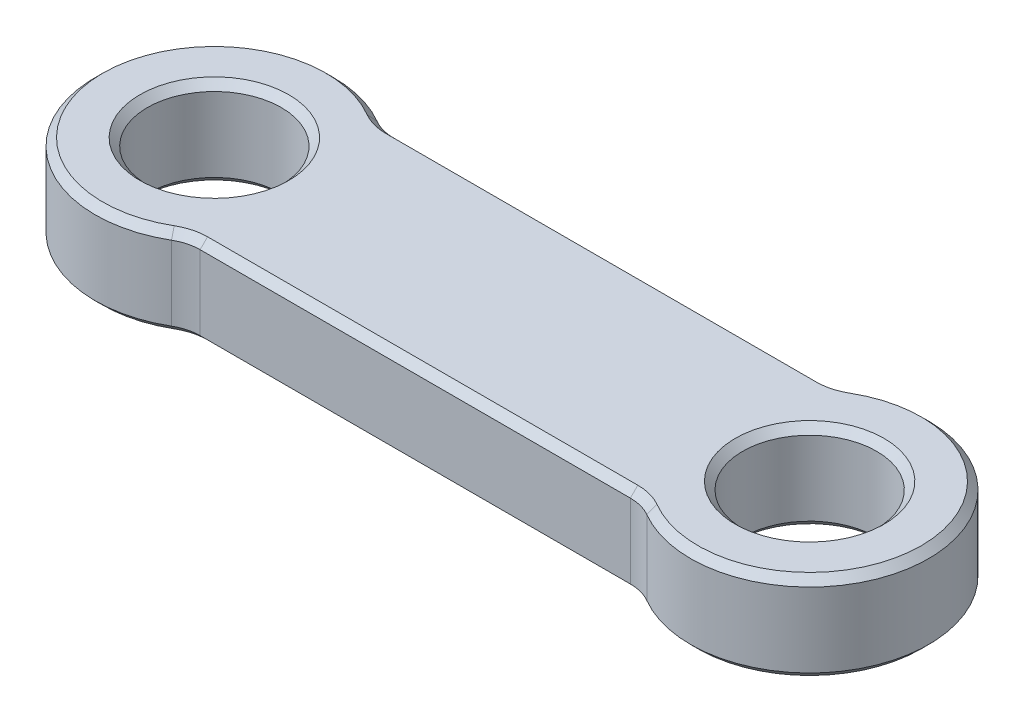
ISO-10303-21;
HEADER;
FILE_DESCRIPTION(('STEP AP214'),'2;1');
FILE_NAME('part.step','',(''),(''),'','','');
FILE_SCHEMA(('AUTOMOTIVE_DESIGN { 1 0 10303 214 1 1 1 1 }'));
ENDSEC;
DATA;
#1=APPLICATION_CONTEXT('core data for automotive mechanical design processes');
#2=APPLICATION_PROTOCOL_DEFINITION('international standard','automotive_design',2000,#1);
#3=PRODUCT_CONTEXT('',#1,'mechanical');
#4=PRODUCT('Part','Part','',(#3));
#5=PRODUCT_RELATED_PRODUCT_CATEGORY('part','',(#4));
#6=PRODUCT_DEFINITION_FORMATION('','',#4);
#7=PRODUCT_DEFINITION_CONTEXT('part definition',#1,'design');
#8=PRODUCT_DEFINITION('design','',#6,#7);
#9=PRODUCT_DEFINITION_SHAPE('','',#8);
#10=(LENGTH_UNIT() NAMED_UNIT(*) SI_UNIT(.MILLI.,.METRE.));
#11=(NAMED_UNIT(*) PLANE_ANGLE_UNIT() SI_UNIT($,.RADIAN.));
#12=(NAMED_UNIT(*) SI_UNIT($,.STERADIAN.) SOLID_ANGLE_UNIT());
#13=UNCERTAINTY_MEASURE_WITH_UNIT(LENGTH_MEASURE(1.E-05),#10,'distance_accuracy_value','');
#14=(GEOMETRIC_REPRESENTATION_CONTEXT(3) GLOBAL_UNCERTAINTY_ASSIGNED_CONTEXT((#13)) GLOBAL_UNIT_ASSIGNED_CONTEXT((#10,
#11,#12)) REPRESENTATION_CONTEXT('',''));
#15=CARTESIAN_POINT('',(0.,0.,0.));
#16=DIRECTION('',(0.,0.,1.));
#17=DIRECTION('',(1.,0.,0.));
#18=AXIS2_PLACEMENT_3D('',#15,#16,#17);
#19=CARTESIAN_POINT('',(-20.,6.,0.));
#20=DIRECTION('',(0.,-1.,0.));
#21=DIRECTION('',(0.,0.,-1.));
#22=AXIS2_PLACEMENT_3D('',#19,#20,#21);
#23=PLANE('',#22);
#24=CARTESIAN_POINT('',(20.,6.,0.));
#25=DIRECTION('',(0.,-1.,0.));
#26=DIRECTION('',(0.,0.,-1.));
#27=AXIS2_PLACEMENT_3D('',#24,#25,#26);
#28=CIRCLE('',#27,5.00000000000001);
#29=CARTESIAN_POINT('',(20.,6.,-5.00000000000001));
#30=VERTEX_POINT('',#29);
#31=EDGE_CURVE('E306',#30,#30,#28,.T.);
#32=ORIENTED_EDGE('',*,*,#31,.T.);
#33=EDGE_LOOP('',(#32));
#34=FACE_BOUND('',#33,.T.);
#35=CARTESIAN_POINT('',(-20.,6.,0.));
#36=DIRECTION('',(0.,-1.,0.));
#37=DIRECTION('',(0.,0.,-1.));
#38=AXIS2_PLACEMENT_3D('',#35,#36,#37);
#39=CIRCLE('',#38,5.00000000000001);
#40=CARTESIAN_POINT('',(-20.,6.,-5.00000000000001));
#41=VERTEX_POINT('',#40);
#42=EDGE_CURVE('E309',#41,#41,#39,.T.);
#43=ORIENTED_EDGE('',*,*,#42,.T.);
#44=EDGE_LOOP('',(#43));
#45=FACE_BOUND('',#44,.T.);
#46=CARTESIAN_POINT('',(-14.4547317467953,6.,9.5));
#47=DIRECTION('',(0.,-1.,0.));
#48=DIRECTION('',(0.,0.,-1.));
#49=AXIS2_PLACEMENT_3D('',#46,#47,#48);
#50=CIRCLE('',#49,3.49999999999999);
#51=CARTESIAN_POINT('',(-16.2191352819059,6.,6.47727272727273));
#52=VERTEX_POINT('',#51);
#53=CARTESIAN_POINT('',(-14.4547317467953,6.,6.));
#54=VERTEX_POINT('',#53);
#55=EDGE_CURVE('E317',#52,#54,#50,.T.);
#56=ORIENTED_EDGE('',*,*,#55,.T.);
#57=DIRECTION('',(1.,0.,0.));
#58=VECTOR('',#57,1.);
#59=CARTESIAN_POINT('',(-20.,6.,6.));
#60=LINE('',#59,#58);
#61=CARTESIAN_POINT('',(14.4547317467953,6.,6.));
#62=VERTEX_POINT('',#61);
#63=EDGE_CURVE('E312',#54,#62,#60,.T.);
#64=ORIENTED_EDGE('',*,*,#63,.T.);
#65=CARTESIAN_POINT('',(14.4547317467953,6.,9.5));
#66=DIRECTION('',(0.,-1.,0.));
#67=DIRECTION('',(0.,0.,-1.));
#68=AXIS2_PLACEMENT_3D('',#65,#66,#67);
#69=CIRCLE('',#68,3.49999999999999);
#70=CARTESIAN_POINT('',(16.2191352819059,6.,6.47727272727273));
#71=VERTEX_POINT('',#70);
#72=EDGE_CURVE('E315',#62,#71,#69,.T.);
#73=ORIENTED_EDGE('',*,*,#72,.T.);
#74=CARTESIAN_POINT('',(20.,6.,0.));
#75=DIRECTION('',(0.,-1.,0.));
#76=DIRECTION('',(0.,0.,-1.));
#77=AXIS2_PLACEMENT_3D('',#74,#75,#76);
#78=CIRCLE('',#77,7.5);
#79=CARTESIAN_POINT('',(16.2191352819059,6.,-6.47727272727273));
#80=VERTEX_POINT('',#79);
#81=EDGE_CURVE('E319',#71,#80,#78,.F.);
#82=ORIENTED_EDGE('',*,*,#81,.T.);
#83=CARTESIAN_POINT('',(14.4547317467953,6.,-9.5));
#84=DIRECTION('',(0.,-1.,0.));
#85=DIRECTION('',(0.,0.,-1.));
#86=AXIS2_PLACEMENT_3D('',#83,#84,#85);
#87=CIRCLE('',#86,3.49999999999999);
#88=CARTESIAN_POINT('',(14.4547317467953,6.,-6.00000000000001));
#89=VERTEX_POINT('',#88);
#90=EDGE_CURVE('E274',#80,#89,#87,.T.);
#91=ORIENTED_EDGE('',*,*,#90,.T.);
#92=DIRECTION('',(-1.,0.,0.));
#93=VECTOR('',#92,1.);
#94=CARTESIAN_POINT('',(-20.,6.,-6.00000000000001));
#95=LINE('',#94,#93);
#96=CARTESIAN_POINT('',(-14.4547317467953,6.,-6.00000000000001));
#97=VERTEX_POINT('',#96);
#98=EDGE_CURVE('E270',#89,#97,#95,.T.);
#99=ORIENTED_EDGE('',*,*,#98,.T.);
#100=CARTESIAN_POINT('',(-14.4547317467953,6.,-9.5));
#101=DIRECTION('',(0.,-1.,0.));
#102=DIRECTION('',(0.,0.,-1.));
#103=AXIS2_PLACEMENT_3D('',#100,#101,#102);
#104=CIRCLE('',#103,3.49999999999999);
#105=CARTESIAN_POINT('',(-16.2191352819059,6.,-6.47727272727273));
#106=VERTEX_POINT('',#105);
#107=EDGE_CURVE('E324',#97,#106,#104,.T.);
#108=ORIENTED_EDGE('',*,*,#107,.T.);
#109=CARTESIAN_POINT('',(-20.,6.,0.));
#110=DIRECTION('',(0.,-1.,0.));
#111=DIRECTION('',(0.,0.,-1.));
#112=AXIS2_PLACEMENT_3D('',#109,#110,#111);
#113=CIRCLE('',#112,7.50000000000001);
#114=EDGE_CURVE('E321',#106,#52,#113,.F.);
#115=ORIENTED_EDGE('',*,*,#114,.T.);
#116=EDGE_LOOP('',(#56,#64,#73,#82,#91,#99,#108,#115));
#117=FACE_BOUND('',#116,.T.);
#118=ADVANCED_FACE('F44',(#34,#45,#117),#23,.F.);
#119=CARTESIAN_POINT('',(-20.,0.,0.));
#120=DIRECTION('',(0.,-1.,0.));
#121=DIRECTION('',(0.,0.,-1.));
#122=AXIS2_PLACEMENT_3D('',#119,#120,#121);
#123=PLANE('',#122);
#124=CARTESIAN_POINT('',(20.,0.,0.));
#125=DIRECTION('',(0.,-1.,0.));
#126=DIRECTION('',(0.,0.,-1.));
#127=AXIS2_PLACEMENT_3D('',#124,#125,#126);
#128=CIRCLE('',#127,5.);
#129=CARTESIAN_POINT('',(20.,0.,-5.));
#130=VERTEX_POINT('',#129);
#131=EDGE_CURVE('E333',#130,#130,#128,.F.);
#132=ORIENTED_EDGE('',*,*,#131,.T.);
#133=EDGE_LOOP('',(#132));
#134=FACE_BOUND('',#133,.T.);
#135=CARTESIAN_POINT('',(-20.,0.,0.));
#136=DIRECTION('',(0.,-1.,0.));
#137=DIRECTION('',(0.,0.,-1.));
#138=AXIS2_PLACEMENT_3D('',#135,#136,#137);
#139=CIRCLE('',#138,5.);
#140=CARTESIAN_POINT('',(-20.,0.,-5.));
#141=VERTEX_POINT('',#140);
#142=EDGE_CURVE('E336',#141,#141,#139,.F.);
#143=ORIENTED_EDGE('',*,*,#142,.T.);
#144=EDGE_LOOP('',(#143));
#145=FACE_BOUND('',#144,.T.);
#146=CARTESIAN_POINT('',(14.4547317467953,0.,9.5));
#147=DIRECTION('',(0.,-1.,0.));
#148=DIRECTION('',(0.,0.,-1.));
#149=AXIS2_PLACEMENT_3D('',#146,#147,#148);
#150=CIRCLE('',#149,3.5);
#151=CARTESIAN_POINT('',(16.2191352819059,0.,6.47727272727272));
#152=VERTEX_POINT('',#151);
#153=CARTESIAN_POINT('',(14.4547317467953,0.,6.));
#154=VERTEX_POINT('',#153);
#155=EDGE_CURVE('E342',#152,#154,#150,.F.);
#156=ORIENTED_EDGE('',*,*,#155,.T.);
#157=DIRECTION('',(-1.,0.,0.));
#158=VECTOR('',#157,1.);
#159=CARTESIAN_POINT('',(-14.4547317467953,0.,5.99999999999999));
#160=LINE('',#159,#158);
#161=CARTESIAN_POINT('',(-14.4547317467953,0.,6.));
#162=VERTEX_POINT('',#161);
#163=EDGE_CURVE('E339',#154,#162,#160,.T.);
#164=ORIENTED_EDGE('',*,*,#163,.T.);
#165=CARTESIAN_POINT('',(-14.4547317467953,0.,9.5));
#166=DIRECTION('',(0.,-1.,0.));
#167=DIRECTION('',(0.,0.,-1.));
#168=AXIS2_PLACEMENT_3D('',#165,#166,#167);
#169=CIRCLE('',#168,3.5);
#170=CARTESIAN_POINT('',(-16.2191352819059,0.,6.47727272727273));
#171=VERTEX_POINT('',#170);
#172=EDGE_CURVE('E344',#162,#171,#169,.F.);
#173=ORIENTED_EDGE('',*,*,#172,.T.);
#174=CARTESIAN_POINT('',(-20.,0.,0.));
#175=DIRECTION('',(0.,-1.,0.));
#176=DIRECTION('',(0.,0.,-1.));
#177=AXIS2_PLACEMENT_3D('',#174,#175,#176);
#178=CIRCLE('',#177,7.5);
#179=CARTESIAN_POINT('',(-16.2191352819059,0.,-6.47727272727273));
#180=VERTEX_POINT('',#179);
#181=EDGE_CURVE('E165',#171,#180,#178,.T.);
#182=ORIENTED_EDGE('',*,*,#181,.T.);
#183=CARTESIAN_POINT('',(-14.4547317467953,0.,-9.5));
#184=DIRECTION('',(0.,-1.,0.));
#185=DIRECTION('',(0.,0.,-1.));
#186=AXIS2_PLACEMENT_3D('',#183,#184,#185);
#187=CIRCLE('',#186,3.5);
#188=CARTESIAN_POINT('',(-14.4547317467953,0.,-6.));
#189=VERTEX_POINT('',#188);
#190=EDGE_CURVE('E159',#180,#189,#187,.F.);
#191=ORIENTED_EDGE('',*,*,#190,.T.);
#192=DIRECTION('',(1.,0.,0.));
#193=VECTOR('',#192,1.);
#194=CARTESIAN_POINT('',(14.4547317467953,0.,-6.));
#195=LINE('',#194,#193);
#196=CARTESIAN_POINT('',(14.4547317467953,0.,-6.));
#197=VERTEX_POINT('',#196);
#198=EDGE_CURVE('E162',#189,#197,#195,.T.);
#199=ORIENTED_EDGE('',*,*,#198,.T.);
#200=CARTESIAN_POINT('',(14.4547317467953,0.,-9.5));
#201=DIRECTION('',(0.,-1.,0.));
#202=DIRECTION('',(0.,0.,-1.));
#203=AXIS2_PLACEMENT_3D('',#200,#201,#202);
#204=CIRCLE('',#203,3.5);
#205=CARTESIAN_POINT('',(16.2191352819059,0.,-6.47727272727272));
#206=VERTEX_POINT('',#205);
#207=EDGE_CURVE('E170',#197,#206,#204,.F.);
#208=ORIENTED_EDGE('',*,*,#207,.T.);
#209=CARTESIAN_POINT('',(20.,0.,0.));
#210=DIRECTION('',(0.,-1.,0.));
#211=DIRECTION('',(0.,0.,-1.));
#212=AXIS2_PLACEMENT_3D('',#209,#210,#211);
#213=CIRCLE('',#212,7.49999999999999);
#214=EDGE_CURVE('E346',#206,#152,#213,.T.);
#215=ORIENTED_EDGE('',*,*,#214,.T.);
#216=EDGE_LOOP('',(#156,#164,#173,#182,#191,#199,#208,#215));
#217=FACE_BOUND('',#216,.T.);
#218=ADVANCED_FACE('F161',(#134,#145,#217),#123,.T.);
#219=CARTESIAN_POINT('',(-20.,6.,0.));
#220=DIRECTION('',(0.,-1.,0.));
#221=DIRECTION('',(0.,0.,-1.));
#222=AXIS2_PLACEMENT_3D('',#219,#220,#221);
#223=CYLINDRICAL_SURFACE('',#222,8.00000000000001);
#224=DIRECTION('',(0.,-1.,0.));
#225=VECTOR('',#224,1.);
#226=CARTESIAN_POINT('',(-15.9670776340329,6.,-6.90909090909091));
#227=LINE('',#226,#225);
#228=CARTESIAN_POINT('',(-15.9670776340329,5.5,-6.90909090909091));
#229=VERTEX_POINT('',#228);
#230=CARTESIAN_POINT('',(-15.9670776340329,0.499999999999994,-6.90909090909091));
#231=VERTEX_POINT('',#230);
#232=EDGE_CURVE('E187',#229,#231,#227,.T.);
#233=ORIENTED_EDGE('',*,*,#232,.T.);
#234=CARTESIAN_POINT('',(-20.,0.499999999999994,0.));
#235=DIRECTION('',(0.,-1.,0.));
#236=DIRECTION('',(0.,0.,-1.));
#237=AXIS2_PLACEMENT_3D('',#234,#235,#236);
#238=CIRCLE('',#237,8.00000000000001);
#239=CARTESIAN_POINT('',(-15.9670776340329,0.499999999999994,6.90909090909091));
#240=VERTEX_POINT('',#239);
#241=EDGE_CURVE('E241',#231,#240,#238,.F.);
#242=ORIENTED_EDGE('',*,*,#241,.T.);
#243=DIRECTION('',(0.,-1.,0.));
#244=VECTOR('',#243,1.);
#245=CARTESIAN_POINT('',(-15.9670776340329,6.,6.90909090909091));
#246=LINE('',#245,#244);
#247=CARTESIAN_POINT('',(-15.9670776340329,5.5,6.90909090909091));
#248=VERTEX_POINT('',#247);
#249=EDGE_CURVE('E184',#240,#248,#246,.F.);
#250=ORIENTED_EDGE('',*,*,#249,.T.);
#251=CARTESIAN_POINT('',(-20.,5.5,0.));
#252=DIRECTION('',(0.,-1.,0.));
#253=DIRECTION('',(0.,0.,-1.));
#254=AXIS2_PLACEMENT_3D('',#251,#252,#253);
#255=CIRCLE('',#254,8.00000000000001);
#256=EDGE_CURVE('E247',#248,#229,#255,.T.);
#257=ORIENTED_EDGE('',*,*,#256,.T.);
#258=EDGE_LOOP('',(#233,#242,#250,#257));
#259=FACE_BOUND('',#258,.T.);
#260=ADVANCED_FACE('F360',(#259),#223,.T.);
#261=CARTESIAN_POINT('',(15.3363104734556,6.,6.5));
#262=DIRECTION('',(0.,0.,-1.));
#263=DIRECTION('',(-1.,0.,0.));
#264=AXIS2_PLACEMENT_3D('',#261,#262,#263);
#265=PLANE('',#264);
#266=DIRECTION('',(0.,1.,0.));
#267=VECTOR('',#266,1.);
#268=CARTESIAN_POINT('',(-14.4547317467953,0.,6.5));
#269=LINE('',#268,#267);
#270=CARTESIAN_POINT('',(-14.4547317467953,5.5,6.5));
#271=VERTEX_POINT('',#270);
#272=CARTESIAN_POINT('',(-14.4547317467953,0.499999999999994,6.5));
#273=VERTEX_POINT('',#272);
#274=EDGE_CURVE('E352',#271,#273,#269,.F.);
#275=ORIENTED_EDGE('',*,*,#274,.T.);
#276=DIRECTION('',(1.,0.,0.));
#277=VECTOR('',#276,1.);
#278=CARTESIAN_POINT('',(14.4547317467953,0.499999999999994,6.5));
#279=LINE('',#278,#277);
#280=CARTESIAN_POINT('',(14.4547317467953,0.499999999999994,6.5));
#281=VERTEX_POINT('',#280);
#282=EDGE_CURVE('E294',#273,#281,#279,.T.);
#283=ORIENTED_EDGE('',*,*,#282,.T.);
#284=DIRECTION('',(0.,1.,0.));
#285=VECTOR('',#284,1.);
#286=CARTESIAN_POINT('',(14.4547317467953,6.,6.5));
#287=LINE('',#286,#285);
#288=CARTESIAN_POINT('',(14.4547317467953,5.5,6.5));
#289=VERTEX_POINT('',#288);
#290=EDGE_CURVE('E180',#281,#289,#287,.T.);
#291=ORIENTED_EDGE('',*,*,#290,.T.);
#292=DIRECTION('',(-1.,0.,0.));
#293=VECTOR('',#292,1.);
#294=CARTESIAN_POINT('',(15.3363104734556,5.5,6.5));
#295=LINE('',#294,#293);
#296=EDGE_CURVE('E297',#289,#271,#295,.T.);
#297=ORIENTED_EDGE('',*,*,#296,.T.);
#298=EDGE_LOOP('',(#275,#283,#291,#297));
#299=FACE_BOUND('',#298,.T.);
#300=ADVANCED_FACE('F381',(#299),#265,.F.);
#301=CARTESIAN_POINT('',(20.,6.,0.));
#302=DIRECTION('',(0.,-1.,0.));
#303=DIRECTION('',(0.,0.,-1.));
#304=AXIS2_PLACEMENT_3D('',#301,#302,#303);
#305=CYLINDRICAL_SURFACE('',#304,7.99999999999999);
#306=DIRECTION('',(0.,-1.,0.));
#307=VECTOR('',#306,1.);
#308=CARTESIAN_POINT('',(15.9670776340329,6.,6.9090909090909));
#309=LINE('',#308,#307);
#310=CARTESIAN_POINT('',(15.9670776340329,5.5,6.9090909090909));
#311=VERTEX_POINT('',#310);
#312=CARTESIAN_POINT('',(15.9670776340329,0.499999999999994,6.9090909090909));
#313=VERTEX_POINT('',#312);
#314=EDGE_CURVE('E357',#311,#313,#309,.T.);
#315=ORIENTED_EDGE('',*,*,#314,.T.);
#316=CARTESIAN_POINT('',(20.,0.499999999999994,0.));
#317=DIRECTION('',(0.,-1.,0.));
#318=DIRECTION('',(0.,0.,-1.));
#319=AXIS2_PLACEMENT_3D('',#316,#317,#318);
#320=CIRCLE('',#319,7.99999999999999);
#321=CARTESIAN_POINT('',(15.9670776340329,0.499999999999994,-6.90909090909091));
#322=VERTEX_POINT('',#321);
#323=EDGE_CURVE('E251',#313,#322,#320,.F.);
#324=ORIENTED_EDGE('',*,*,#323,.T.);
#325=DIRECTION('',(0.,-1.,0.));
#326=VECTOR('',#325,1.);
#327=CARTESIAN_POINT('',(15.9670776340329,6.,-6.90909090909091));
#328=LINE('',#327,#326);
#329=CARTESIAN_POINT('',(15.9670776340329,5.5,-6.90909090909091));
#330=VERTEX_POINT('',#329);
#331=EDGE_CURVE('E355',#322,#330,#328,.F.);
#332=ORIENTED_EDGE('',*,*,#331,.T.);
#333=CARTESIAN_POINT('',(20.,5.5,0.));
#334=DIRECTION('',(0.,-1.,0.));
#335=DIRECTION('',(0.,0.,-1.));
#336=AXIS2_PLACEMENT_3D('',#333,#334,#335);
#337=CIRCLE('',#336,7.99999999999999);
#338=EDGE_CURVE('E278',#330,#311,#337,.T.);
#339=ORIENTED_EDGE('',*,*,#338,.T.);
#340=EDGE_LOOP('',(#315,#324,#332,#339));
#341=FACE_BOUND('',#340,.T.);
#342=ADVANCED_FACE('F422',(#341),#305,.T.);
#343=CARTESIAN_POINT('',(-15.3363104734556,6.,-6.5));
#344=DIRECTION('',(0.,0.,1.));
#345=DIRECTION('',(1.,0.,0.));
#346=AXIS2_PLACEMENT_3D('',#343,#344,#345);
#347=PLANE('',#346);
#348=DIRECTION('',(0.,1.,0.));
#349=VECTOR('',#348,1.);
#350=CARTESIAN_POINT('',(14.4547317467953,0.,-6.5));
#351=LINE('',#350,#349);
#352=CARTESIAN_POINT('',(14.4547317467953,5.5,-6.5));
#353=VERTEX_POINT('',#352);
#354=CARTESIAN_POINT('',(14.4547317467953,0.499999999999994,-6.5));
#355=VERTEX_POINT('',#354);
#356=EDGE_CURVE('E260',#353,#355,#351,.F.);
#357=ORIENTED_EDGE('',*,*,#356,.T.);
#358=DIRECTION('',(-1.,0.,0.));
#359=VECTOR('',#358,1.);
#360=CARTESIAN_POINT('',(-14.4547317467953,0.499999999999994,-6.5));
#361=LINE('',#360,#359);
#362=CARTESIAN_POINT('',(-14.4547317467953,0.499999999999994,-6.5));
#363=VERTEX_POINT('',#362);
#364=EDGE_CURVE('E11',#355,#363,#361,.T.);
#365=ORIENTED_EDGE('',*,*,#364,.T.);
#366=DIRECTION('',(0.,1.,0.));
#367=VECTOR('',#366,1.);
#368=CARTESIAN_POINT('',(-14.4547317467953,6.,-6.5));
#369=LINE('',#368,#367);
#370=CARTESIAN_POINT('',(-14.4547317467953,5.5,-6.5));
#371=VERTEX_POINT('',#370);
#372=EDGE_CURVE('E261',#363,#371,#369,.T.);
#373=ORIENTED_EDGE('',*,*,#372,.T.);
#374=DIRECTION('',(1.,0.,0.));
#375=VECTOR('',#374,1.);
#376=CARTESIAN_POINT('',(-15.3363104734556,5.5,-6.5));
#377=LINE('',#376,#375);
#378=EDGE_CURVE('E54',#371,#353,#377,.T.);
#379=ORIENTED_EDGE('',*,*,#378,.T.);
#380=EDGE_LOOP('',(#357,#365,#373,#379));
#381=FACE_BOUND('',#380,.T.);
#382=ADVANCED_FACE('F259',(#381),#347,.F.);
#383=CARTESIAN_POINT('',(-20.,6.,0.));
#384=DIRECTION('',(0.,-1.,0.));
#385=DIRECTION('',(0.,0.,-1.));
#386=AXIS2_PLACEMENT_3D('',#383,#384,#385);
#387=CYLINDRICAL_SURFACE('',#386,4.5);
#388=CARTESIAN_POINT('',(-20.,0.499999999999994,0.));
#389=DIRECTION('',(0.,-1.,0.));
#390=DIRECTION('',(0.,0.,-1.));
#391=AXIS2_PLACEMENT_3D('',#388,#389,#390);
#392=CIRCLE('',#391,4.5);
#393=CARTESIAN_POINT('',(-20.,0.499999999999994,-4.5));
#394=VERTEX_POINT('',#393);
#395=EDGE_CURVE('E300',#394,#394,#392,.T.);
#396=ORIENTED_EDGE('',*,*,#395,.T.);
#397=EDGE_LOOP('',(#396));
#398=FACE_BOUND('',#397,.T.);
#399=CARTESIAN_POINT('',(-20.,5.5,0.));
#400=DIRECTION('',(0.,-1.,0.));
#401=DIRECTION('',(0.,0.,-1.));
#402=AXIS2_PLACEMENT_3D('',#399,#400,#401);
#403=CIRCLE('',#402,4.5);
#404=CARTESIAN_POINT('',(-20.,5.5,-4.5));
#405=VERTEX_POINT('',#404);
#406=EDGE_CURVE('E303',#405,#405,#403,.F.);
#407=ORIENTED_EDGE('',*,*,#406,.T.);
#408=EDGE_LOOP('',(#407));
#409=FACE_BOUND('',#408,.T.);
#410=ADVANCED_FACE('F417',(#398,#409),#387,.F.);
#411=CARTESIAN_POINT('',(20.,6.,0.));
#412=DIRECTION('',(0.,-1.,0.));
#413=DIRECTION('',(0.,0.,-1.));
#414=AXIS2_PLACEMENT_3D('',#411,#412,#413);
#415=CYLINDRICAL_SURFACE('',#414,4.5);
#416=CARTESIAN_POINT('',(20.,0.499999999999994,0.));
#417=DIRECTION('',(0.,-1.,0.));
#418=DIRECTION('',(0.,0.,-1.));
#419=AXIS2_PLACEMENT_3D('',#416,#417,#418);
#420=CIRCLE('',#419,4.5);
#421=CARTESIAN_POINT('',(20.,0.499999999999994,-4.5));
#422=VERTEX_POINT('',#421);
#423=EDGE_CURVE('E327',#422,#422,#420,.T.);
#424=ORIENTED_EDGE('',*,*,#423,.T.);
#425=EDGE_LOOP('',(#424));
#426=FACE_BOUND('',#425,.T.);
#427=CARTESIAN_POINT('',(20.,5.5,0.));
#428=DIRECTION('',(0.,-1.,0.));
#429=DIRECTION('',(0.,0.,-1.));
#430=AXIS2_PLACEMENT_3D('',#427,#428,#429);
#431=CIRCLE('',#430,4.5);
#432=CARTESIAN_POINT('',(20.,5.5,-4.5));
#433=VERTEX_POINT('',#432);
#434=EDGE_CURVE('E330',#433,#433,#431,.F.);
#435=ORIENTED_EDGE('',*,*,#434,.T.);
#436=EDGE_LOOP('',(#435));
#437=FACE_BOUND('',#436,.T.);
#438=ADVANCED_FACE('F431',(#426,#437),#415,.F.);
#439=CARTESIAN_POINT('',(-14.4547317467953,6.,-9.5));
#440=DIRECTION('',(0.,-1.,0.));
#441=DIRECTION('',(0.,0.,-1.));
#442=AXIS2_PLACEMENT_3D('',#439,#440,#441);
#443=CYLINDRICAL_SURFACE('',#442,3.);
#444=ORIENTED_EDGE('',*,*,#372,.F.);
#445=CARTESIAN_POINT('',(-14.4547317467953,0.499999999999994,-9.5));
#446=DIRECTION('',(0.,-1.,0.));
#447=DIRECTION('',(0.,0.,-1.));
#448=AXIS2_PLACEMENT_3D('',#445,#446,#447);
#449=CIRCLE('',#448,3.);
#450=EDGE_CURVE('E183',#363,#231,#449,.T.);
#451=ORIENTED_EDGE('',*,*,#450,.T.);
#452=ORIENTED_EDGE('',*,*,#232,.F.);
#453=CARTESIAN_POINT('',(-14.4547317467953,5.5,-9.5));
#454=DIRECTION('',(0.,-1.,0.));
#455=DIRECTION('',(0.,0.,-1.));
#456=AXIS2_PLACEMENT_3D('',#453,#454,#455);
#457=CIRCLE('',#456,3.);
#458=EDGE_CURVE('E62',#229,#371,#457,.F.);
#459=ORIENTED_EDGE('',*,*,#458,.T.);
#460=EDGE_LOOP('',(#444,#451,#452,#459));
#461=FACE_BOUND('',#460,.T.);
#462=ADVANCED_FACE('F362',(#461),#443,.F.);
#463=CARTESIAN_POINT('',(14.4547317467953,6.,-9.5));
#464=DIRECTION('',(0.,-1.,0.));
#465=DIRECTION('',(0.,0.,-1.));
#466=AXIS2_PLACEMENT_3D('',#463,#464,#465);
#467=CYLINDRICAL_SURFACE('',#466,3.);
#468=ORIENTED_EDGE('',*,*,#331,.F.);
#469=CARTESIAN_POINT('',(14.4547317467953,0.499999999999994,-9.5));
#470=DIRECTION('',(0.,-1.,0.));
#471=DIRECTION('',(0.,0.,-1.));
#472=AXIS2_PLACEMENT_3D('',#469,#470,#471);
#473=CIRCLE('',#472,3.);
#474=EDGE_CURVE('E249',#322,#355,#473,.T.);
#475=ORIENTED_EDGE('',*,*,#474,.T.);
#476=ORIENTED_EDGE('',*,*,#356,.F.);
#477=CARTESIAN_POINT('',(14.4547317467953,5.5,-9.5));
#478=DIRECTION('',(0.,-1.,0.));
#479=DIRECTION('',(0.,0.,-1.));
#480=AXIS2_PLACEMENT_3D('',#477,#478,#479);
#481=CIRCLE('',#480,3.);
#482=EDGE_CURVE('E246',#353,#330,#481,.F.);
#483=ORIENTED_EDGE('',*,*,#482,.T.);
#484=EDGE_LOOP('',(#468,#475,#476,#483));
#485=FACE_BOUND('',#484,.T.);
#486=ADVANCED_FACE('F265',(#485),#467,.F.);
#487=CARTESIAN_POINT('',(14.4547317467953,6.,9.5));
#488=DIRECTION('',(0.,-1.,0.));
#489=DIRECTION('',(0.,0.,-1.));
#490=AXIS2_PLACEMENT_3D('',#487,#488,#489);
#491=CYLINDRICAL_SURFACE('',#490,3.);
#492=ORIENTED_EDGE('',*,*,#290,.F.);
#493=CARTESIAN_POINT('',(14.4547317467953,0.499999999999994,9.5));
#494=DIRECTION('',(0.,-1.,0.));
#495=DIRECTION('',(0.,0.,-1.));
#496=AXIS2_PLACEMENT_3D('',#493,#494,#495);
#497=CIRCLE('',#496,3.);
#498=EDGE_CURVE('E290',#281,#313,#497,.T.);
#499=ORIENTED_EDGE('',*,*,#498,.T.);
#500=ORIENTED_EDGE('',*,*,#314,.F.);
#501=CARTESIAN_POINT('',(14.4547317467953,5.5,9.5));
#502=DIRECTION('',(0.,-1.,0.));
#503=DIRECTION('',(0.,0.,-1.));
#504=AXIS2_PLACEMENT_3D('',#501,#502,#503);
#505=CIRCLE('',#504,3.);
#506=EDGE_CURVE('E292',#311,#289,#505,.F.);
#507=ORIENTED_EDGE('',*,*,#506,.T.);
#508=EDGE_LOOP('',(#492,#499,#500,#507));
#509=FACE_BOUND('',#508,.T.);
#510=ADVANCED_FACE('F378',(#509),#491,.F.);
#511=CARTESIAN_POINT('',(-14.4547317467953,6.,9.5));
#512=DIRECTION('',(0.,-1.,0.));
#513=DIRECTION('',(0.,0.,-1.));
#514=AXIS2_PLACEMENT_3D('',#511,#512,#513);
#515=CYLINDRICAL_SURFACE('',#514,3.);
#516=ORIENTED_EDGE('',*,*,#249,.F.);
#517=CARTESIAN_POINT('',(-14.4547317467953,0.499999999999994,9.5));
#518=DIRECTION('',(0.,-1.,0.));
#519=DIRECTION('',(0.,0.,-1.));
#520=AXIS2_PLACEMENT_3D('',#517,#518,#519);
#521=CIRCLE('',#520,3.);
#522=EDGE_CURVE('E284',#240,#273,#521,.T.);
#523=ORIENTED_EDGE('',*,*,#522,.T.);
#524=ORIENTED_EDGE('',*,*,#274,.F.);
#525=CARTESIAN_POINT('',(-14.4547317467953,5.5,9.5));
#526=DIRECTION('',(0.,-1.,0.));
#527=DIRECTION('',(0.,0.,-1.));
#528=AXIS2_PLACEMENT_3D('',#525,#526,#527);
#529=CIRCLE('',#528,3.);
#530=EDGE_CURVE('E286',#271,#248,#529,.F.);
#531=ORIENTED_EDGE('',*,*,#530,.T.);
#532=EDGE_LOOP('',(#516,#523,#524,#531));
#533=FACE_BOUND('',#532,.T.);
#534=ADVANCED_FACE('F390',(#533),#515,.F.);
#535=CARTESIAN_POINT('',(20.,0.,0.));
#536=DIRECTION('',(0.,-1.,0.));
#537=DIRECTION('',(0.,0.,-1.));
#538=AXIS2_PLACEMENT_3D('',#535,#536,#537);
#539=CONICAL_SURFACE('',#538,5.,0.78539816339745);
#540=ORIENTED_EDGE('',*,*,#423,.F.);
#541=EDGE_LOOP('',(#540));
#542=FACE_BOUND('',#541,.T.);
#543=ORIENTED_EDGE('',*,*,#131,.F.);
#544=EDGE_LOOP('',(#543));
#545=FACE_BOUND('',#544,.T.);
#546=ADVANCED_FACE('F438',(#542,#545),#539,.F.);
#547=CARTESIAN_POINT('',(20.,5.5,0.));
#548=DIRECTION('',(0.,1.,0.));
#549=DIRECTION('',(0.,0.,1.));
#550=AXIS2_PLACEMENT_3D('',#547,#548,#549);
#551=CONICAL_SURFACE('',#550,4.5,0.785398163397453);
#552=ORIENTED_EDGE('',*,*,#31,.F.);
#553=EDGE_LOOP('',(#552));
#554=FACE_BOUND('',#553,.T.);
#555=ORIENTED_EDGE('',*,*,#434,.F.);
#556=EDGE_LOOP('',(#555));
#557=FACE_BOUND('',#556,.T.);
#558=ADVANCED_FACE('F445',(#554,#557),#551,.F.);
#559=CARTESIAN_POINT('',(-20.,0.,0.));
#560=DIRECTION('',(0.,-1.,0.));
#561=DIRECTION('',(0.,0.,-1.));
#562=AXIS2_PLACEMENT_3D('',#559,#560,#561);
#563=CONICAL_SURFACE('',#562,5.,0.78539816339745);
#564=ORIENTED_EDGE('',*,*,#395,.F.);
#565=EDGE_LOOP('',(#564));
#566=FACE_BOUND('',#565,.T.);
#567=ORIENTED_EDGE('',*,*,#142,.F.);
#568=EDGE_LOOP('',(#567));
#569=FACE_BOUND('',#568,.T.);
#570=ADVANCED_FACE('F452',(#566,#569),#563,.F.);
#571=CARTESIAN_POINT('',(-20.,5.5,0.));
#572=DIRECTION('',(0.,1.,0.));
#573=DIRECTION('',(0.,0.,1.));
#574=AXIS2_PLACEMENT_3D('',#571,#572,#573);
#575=CONICAL_SURFACE('',#574,4.5,0.785398163397453);
#576=ORIENTED_EDGE('',*,*,#42,.F.);
#577=EDGE_LOOP('',(#576));
#578=FACE_BOUND('',#577,.T.);
#579=ORIENTED_EDGE('',*,*,#406,.F.);
#580=EDGE_LOOP('',(#579));
#581=FACE_BOUND('',#580,.T.);
#582=ADVANCED_FACE('F458',(#578,#581),#575,.F.);
#583=CARTESIAN_POINT('',(-15.3363104734556,0.499999999999994,-6.5));
#584=DIRECTION('',(0.,-0.707106781186552,-0.707106781186543));
#585=DIRECTION('',(1.,0.,0.));
#586=AXIS2_PLACEMENT_3D('',#583,#584,#585);
#587=PLANE('',#586);
#588=DIRECTION('',(0.,0.707106781186543,-0.707106781186552));
#589=VECTOR('',#588,1.);
#590=CARTESIAN_POINT('',(14.4547317467953,0.,-6.));
#591=LINE('',#590,#589);
#592=EDGE_CURVE('E178',#197,#355,#591,.T.);
#593=ORIENTED_EDGE('',*,*,#592,.F.);
#594=ORIENTED_EDGE('',*,*,#198,.F.);
#595=DIRECTION('',(0.,-0.707106781186543,0.707106781186552));
#596=VECTOR('',#595,1.);
#597=CARTESIAN_POINT('',(-14.4547317467953,0.499999999999994,-6.5));
#598=LINE('',#597,#596);
#599=EDGE_CURVE('E175',#363,#189,#598,.T.);
#600=ORIENTED_EDGE('',*,*,#599,.F.);
#601=ORIENTED_EDGE('',*,*,#364,.F.);
#602=EDGE_LOOP('',(#593,#594,#600,#601));
#603=FACE_BOUND('',#602,.T.);
#604=ADVANCED_FACE('F174',(#603),#587,.T.);
#605=CARTESIAN_POINT('',(-14.4547317467953,0.,-9.5));
#606=DIRECTION('',(0.,-1.,0.));
#607=DIRECTION('',(0.,0.,-1.));
#608=AXIS2_PLACEMENT_3D('',#605,#606,#607);
#609=CONICAL_SURFACE('',#608,3.5,0.785398163397455);
#610=ORIENTED_EDGE('',*,*,#599,.T.);
#611=ORIENTED_EDGE('',*,*,#190,.F.);
#612=DIRECTION('',(-0.35646334412178,-0.707106781186542,0.610683129206567));
#613=VECTOR('',#612,1.);
#614=CARTESIAN_POINT('',(-15.9670776340329,0.499999999999994,-6.90909090909091));
#615=LINE('',#614,#613);
#616=EDGE_CURVE('E189',#231,#180,#615,.T.);
#617=ORIENTED_EDGE('',*,*,#616,.F.);
#618=ORIENTED_EDGE('',*,*,#450,.F.);
#619=EDGE_LOOP('',(#610,#611,#617,#618));
#620=FACE_BOUND('',#619,.T.);
#621=ADVANCED_FACE('F182',(#620),#609,.F.);
#622=CARTESIAN_POINT('',(14.4547317467953,0.,-9.5));
#623=DIRECTION('',(0.,-1.,0.));
#624=DIRECTION('',(0.,0.,-1.));
#625=AXIS2_PLACEMENT_3D('',#622,#623,#624);
#626=CONICAL_SURFACE('',#625,3.5,0.785398163397455);
#627=ORIENTED_EDGE('',*,*,#592,.T.);
#628=ORIENTED_EDGE('',*,*,#474,.F.);
#629=DIRECTION('',(-0.356463344121775,0.707106781186543,-0.61068312920657));
#630=VECTOR('',#629,1.);
#631=CARTESIAN_POINT('',(16.2191352819059,0.,-6.47727272727272));
#632=LINE('',#631,#630);
#633=EDGE_CURVE('E235',#206,#322,#632,.T.);
#634=ORIENTED_EDGE('',*,*,#633,.F.);
#635=ORIENTED_EDGE('',*,*,#207,.F.);
#636=EDGE_LOOP('',(#627,#628,#634,#635));
#637=FACE_BOUND('',#636,.T.);
#638=ADVANCED_FACE('F541',(#637),#626,.F.);
#639=CARTESIAN_POINT('',(-20.,0.499999999999994,0.));
#640=DIRECTION('',(0.,1.,0.));
#641=DIRECTION('',(0.,0.,1.));
#642=AXIS2_PLACEMENT_3D('',#639,#640,#641);
#643=CONICAL_SURFACE('',#642,8.00000000000001,0.785398163397456);
#644=ORIENTED_EDGE('',*,*,#616,.T.);
#645=ORIENTED_EDGE('',*,*,#181,.F.);
#646=DIRECTION('',(-0.35646334412178,-0.707106781186542,-0.610683129206567));
#647=VECTOR('',#646,1.);
#648=CARTESIAN_POINT('',(-15.9670776340329,0.499999999999994,6.90909090909091));
#649=LINE('',#648,#647);
#650=EDGE_CURVE('E232',#240,#171,#649,.T.);
#651=ORIENTED_EDGE('',*,*,#650,.F.);
#652=ORIENTED_EDGE('',*,*,#241,.F.);
#653=EDGE_LOOP('',(#644,#645,#651,#652));
#654=FACE_BOUND('',#653,.T.);
#655=ADVANCED_FACE('F239',(#654),#643,.T.);
#656=CARTESIAN_POINT('',(20.,0.499999999999994,0.));
#657=DIRECTION('',(0.,1.,0.));
#658=DIRECTION('',(0.,0.,1.));
#659=AXIS2_PLACEMENT_3D('',#656,#657,#658);
#660=CONICAL_SURFACE('',#659,7.99999999999999,0.785398163397454);
#661=ORIENTED_EDGE('',*,*,#633,.T.);
#662=ORIENTED_EDGE('',*,*,#323,.F.);
#663=DIRECTION('',(-0.35646334412178,0.707106781186543,0.610683129206566));
#664=VECTOR('',#663,1.);
#665=CARTESIAN_POINT('',(16.2191352819059,0.,6.47727272727272));
#666=LINE('',#665,#664);
#667=EDGE_CURVE('E226',#152,#313,#666,.T.);
#668=ORIENTED_EDGE('',*,*,#667,.F.);
#669=ORIENTED_EDGE('',*,*,#214,.F.);
#670=EDGE_LOOP('',(#661,#662,#668,#669));
#671=FACE_BOUND('',#670,.T.);
#672=ADVANCED_FACE('F561',(#671),#660,.T.);
#673=CARTESIAN_POINT('',(-14.4547317467953,0.,9.5));
#674=DIRECTION('',(0.,-1.,0.));
#675=DIRECTION('',(0.,0.,-1.));
#676=AXIS2_PLACEMENT_3D('',#673,#674,#675);
#677=CONICAL_SURFACE('',#676,3.5,0.785398163397456);
#678=ORIENTED_EDGE('',*,*,#650,.T.);
#679=ORIENTED_EDGE('',*,*,#172,.F.);
#680=DIRECTION('',(0.,-0.707106781186543,-0.707106781186552));
#681=VECTOR('',#680,1.);
#682=CARTESIAN_POINT('',(-14.4547317467953,0.499999999999994,6.5));
#683=LINE('',#682,#681);
#684=EDGE_CURVE('E219',#273,#162,#683,.T.);
#685=ORIENTED_EDGE('',*,*,#684,.F.);
#686=ORIENTED_EDGE('',*,*,#522,.F.);
#687=EDGE_LOOP('',(#678,#679,#685,#686));
#688=FACE_BOUND('',#687,.T.);
#689=ADVANCED_FACE('F394',(#688),#677,.F.);
#690=CARTESIAN_POINT('',(14.4547317467953,0.,9.5));
#691=DIRECTION('',(0.,-1.,0.));
#692=DIRECTION('',(0.,0.,-1.));
#693=AXIS2_PLACEMENT_3D('',#690,#691,#692);
#694=CONICAL_SURFACE('',#693,3.5,0.785398163397455);
#695=ORIENTED_EDGE('',*,*,#667,.T.);
#696=ORIENTED_EDGE('',*,*,#498,.F.);
#697=DIRECTION('',(0.,0.707106781186543,0.707106781186552));
#698=VECTOR('',#697,1.);
#699=CARTESIAN_POINT('',(14.4547317467953,0.,6.));
#700=LINE('',#699,#698);
#701=EDGE_CURVE('E215',#154,#281,#700,.T.);
#702=ORIENTED_EDGE('',*,*,#701,.F.);
#703=ORIENTED_EDGE('',*,*,#155,.F.);
#704=EDGE_LOOP('',(#695,#696,#702,#703));
#705=FACE_BOUND('',#704,.T.);
#706=ADVANCED_FACE('F397',(#705),#694,.F.);
#707=CARTESIAN_POINT('',(15.3363104734556,0.499999999999994,6.5));
#708=DIRECTION('',(0.,-0.707106781186553,0.707106781186542));
#709=DIRECTION('',(-1.,0.,0.));
#710=AXIS2_PLACEMENT_3D('',#707,#708,#709);
#711=PLANE('',#710);
#712=ORIENTED_EDGE('',*,*,#684,.T.);
#713=ORIENTED_EDGE('',*,*,#163,.F.);
#714=ORIENTED_EDGE('',*,*,#701,.T.);
#715=ORIENTED_EDGE('',*,*,#282,.F.);
#716=EDGE_LOOP('',(#712,#713,#714,#715));
#717=FACE_BOUND('',#716,.T.);
#718=ADVANCED_FACE('F395',(#717),#711,.T.);
#719=CARTESIAN_POINT('',(-20.,6.,-6.00000000000001));
#720=DIRECTION('',(0.,-0.707106781186542,0.707106781186553));
#721=DIRECTION('',(-1.,0.,0.));
#722=AXIS2_PLACEMENT_3D('',#719,#720,#721);
#723=PLANE('',#722);
#724=DIRECTION('',(0.,0.707106781186553,0.707106781186542));
#725=VECTOR('',#724,1.);
#726=CARTESIAN_POINT('',(14.4547317467953,5.5,-6.5));
#727=LINE('',#726,#725);
#728=EDGE_CURVE('E208',#353,#89,#727,.T.);
#729=ORIENTED_EDGE('',*,*,#728,.F.);
#730=ORIENTED_EDGE('',*,*,#378,.F.);
#731=DIRECTION('',(0.,-0.707106781186553,-0.707106781186542));
#732=VECTOR('',#731,1.);
#733=CARTESIAN_POINT('',(-14.4547317467953,6.,-6.00000000000001));
#734=LINE('',#733,#732);
#735=EDGE_CURVE('E49',#97,#371,#734,.T.);
#736=ORIENTED_EDGE('',*,*,#735,.F.);
#737=ORIENTED_EDGE('',*,*,#98,.F.);
#738=EDGE_LOOP('',(#729,#730,#736,#737));
#739=FACE_BOUND('',#738,.T.);
#740=ADVANCED_FACE('F47',(#739),#723,.F.);
#741=CARTESIAN_POINT('',(-14.4547317467953,6.,-9.5));
#742=DIRECTION('',(0.,1.,0.));
#743=DIRECTION('',(0.,0.,1.));
#744=AXIS2_PLACEMENT_3D('',#741,#742,#743);
#745=CONICAL_SURFACE('',#744,3.49999999999999,0.785398163397441);
#746=ORIENTED_EDGE('',*,*,#735,.T.);
#747=ORIENTED_EDGE('',*,*,#458,.F.);
#748=DIRECTION('',(0.356463344121775,-0.707106781186552,-0.610683129206559));
#749=VECTOR('',#748,1.);
#750=CARTESIAN_POINT('',(-16.2191352819059,6.,-6.47727272727273));
#751=LINE('',#750,#749);
#752=EDGE_CURVE('E206',#106,#229,#751,.T.);
#753=ORIENTED_EDGE('',*,*,#752,.F.);
#754=ORIENTED_EDGE('',*,*,#107,.F.);
#755=EDGE_LOOP('',(#746,#747,#753,#754));
#756=FACE_BOUND('',#755,.T.);
#757=ADVANCED_FACE('F364',(#756),#745,.F.);
#758=CARTESIAN_POINT('',(14.4547317467953,6.,-9.5));
#759=DIRECTION('',(0.,1.,0.));
#760=DIRECTION('',(0.,0.,1.));
#761=AXIS2_PLACEMENT_3D('',#758,#759,#760);
#762=CONICAL_SURFACE('',#761,3.49999999999999,0.785398163397441);
#763=ORIENTED_EDGE('',*,*,#728,.T.);
#764=ORIENTED_EDGE('',*,*,#90,.F.);
#765=DIRECTION('',(0.356463344121775,0.707106781186552,0.610683129206559));
#766=VECTOR('',#765,1.);
#767=CARTESIAN_POINT('',(15.9670776340329,5.5,-6.90909090909091));
#768=LINE('',#767,#766);
#769=EDGE_CURVE('E203',#330,#80,#768,.T.);
#770=ORIENTED_EDGE('',*,*,#769,.F.);
#771=ORIENTED_EDGE('',*,*,#482,.F.);
#772=EDGE_LOOP('',(#763,#764,#770,#771));
#773=FACE_BOUND('',#772,.T.);
#774=ADVANCED_FACE('F272',(#773),#762,.F.);
#775=CARTESIAN_POINT('',(-20.,6.,0.));
#776=DIRECTION('',(0.,-1.,0.));
#777=DIRECTION('',(0.,0.,-1.));
#778=AXIS2_PLACEMENT_3D('',#775,#776,#777);
#779=CONICAL_SURFACE('',#778,7.50000000000001,0.785398163397441);
#780=ORIENTED_EDGE('',*,*,#752,.T.);
#781=ORIENTED_EDGE('',*,*,#256,.F.);
#782=DIRECTION('',(0.356463344121774,-0.707106781186551,0.61068312920656));
#783=VECTOR('',#782,1.);
#784=CARTESIAN_POINT('',(-16.2191352819059,6.,6.47727272727273));
#785=LINE('',#784,#783);
#786=EDGE_CURVE('E200',#52,#248,#785,.T.);
#787=ORIENTED_EDGE('',*,*,#786,.F.);
#788=ORIENTED_EDGE('',*,*,#114,.F.);
#789=EDGE_LOOP('',(#780,#781,#787,#788));
#790=FACE_BOUND('',#789,.T.);
#791=ADVANCED_FACE('F367',(#790),#779,.T.);
#792=CARTESIAN_POINT('',(20.,6.,0.));
#793=DIRECTION('',(0.,-1.,0.));
#794=DIRECTION('',(0.,0.,-1.));
#795=AXIS2_PLACEMENT_3D('',#792,#793,#794);
#796=CONICAL_SURFACE('',#795,7.5,0.785398163397441);
#797=ORIENTED_EDGE('',*,*,#769,.T.);
#798=ORIENTED_EDGE('',*,*,#81,.F.);
#799=DIRECTION('',(0.356463344121775,0.707106781186552,-0.610683129206559));
#800=VECTOR('',#799,1.);
#801=CARTESIAN_POINT('',(15.9670776340329,5.5,6.9090909090909));
#802=LINE('',#801,#800);
#803=EDGE_CURVE('E197',#311,#71,#802,.T.);
#804=ORIENTED_EDGE('',*,*,#803,.F.);
#805=ORIENTED_EDGE('',*,*,#338,.F.);
#806=EDGE_LOOP('',(#797,#798,#804,#805));
#807=FACE_BOUND('',#806,.T.);
#808=ADVANCED_FACE('F279',(#807),#796,.T.);
#809=CARTESIAN_POINT('',(-14.4547317467953,6.,9.5));
#810=DIRECTION('',(0.,1.,0.));
#811=DIRECTION('',(0.,0.,1.));
#812=AXIS2_PLACEMENT_3D('',#809,#810,#811);
#813=CONICAL_SURFACE('',#812,3.49999999999999,0.785398163397442);
#814=ORIENTED_EDGE('',*,*,#786,.T.);
#815=ORIENTED_EDGE('',*,*,#530,.F.);
#816=DIRECTION('',(0.,-0.707106781186552,0.707106781186543));
#817=VECTOR('',#816,1.);
#818=CARTESIAN_POINT('',(-14.4547317467953,6.,6.));
#819=LINE('',#818,#817);
#820=EDGE_CURVE('E195',#54,#271,#819,.T.);
#821=ORIENTED_EDGE('',*,*,#820,.F.);
#822=ORIENTED_EDGE('',*,*,#55,.F.);
#823=EDGE_LOOP('',(#814,#815,#821,#822));
#824=FACE_BOUND('',#823,.T.);
#825=ADVANCED_FACE('F388',(#824),#813,.F.);
#826=CARTESIAN_POINT('',(14.4547317467953,6.,9.5));
#827=DIRECTION('',(0.,1.,0.));
#828=DIRECTION('',(0.,0.,1.));
#829=AXIS2_PLACEMENT_3D('',#826,#827,#828);
#830=CONICAL_SURFACE('',#829,3.49999999999999,0.785398163397441);
#831=ORIENTED_EDGE('',*,*,#803,.T.);
#832=ORIENTED_EDGE('',*,*,#72,.F.);
#833=DIRECTION('',(0.,0.707106781186552,-0.707106781186543));
#834=VECTOR('',#833,1.);
#835=CARTESIAN_POINT('',(14.4547317467953,5.5,6.5));
#836=LINE('',#835,#834);
#837=EDGE_CURVE('E193',#289,#62,#836,.T.);
#838=ORIENTED_EDGE('',*,*,#837,.F.);
#839=ORIENTED_EDGE('',*,*,#506,.F.);
#840=EDGE_LOOP('',(#831,#832,#838,#839));
#841=FACE_BOUND('',#840,.T.);
#842=ADVANCED_FACE('F374',(#841),#830,.F.);
#843=CARTESIAN_POINT('',(-20.,6.,6.));
#844=DIRECTION('',(0.,-0.707106781186543,-0.707106781186552));
#845=DIRECTION('',(1.,0.,0.));
#846=AXIS2_PLACEMENT_3D('',#843,#844,#845);
#847=PLANE('',#846);
#848=ORIENTED_EDGE('',*,*,#820,.T.);
#849=ORIENTED_EDGE('',*,*,#296,.F.);
#850=ORIENTED_EDGE('',*,*,#837,.T.);
#851=ORIENTED_EDGE('',*,*,#63,.F.);
#852=EDGE_LOOP('',(#848,#849,#850,#851));
#853=FACE_BOUND('',#852,.T.);
#854=ADVANCED_FACE('F384',(#853),#847,.F.);
#855=CLOSED_SHELL('',(#118,#218,#260,#300,#342,#382,#410,#438,#462,#486,#510,#534,#546,#558,
#570,#582,#604,#621,#638,#655,#672,#689,#706,#718,#740,#757,#774,#791,#808,#825,#842,#854));
#856=MANIFOLD_SOLID_BREP('B2',#855);
#857=ADVANCED_BREP_SHAPE_REPRESENTATION('',(#18,#856),#14);
#858=SHAPE_DEFINITION_REPRESENTATION(#9,#857);
ENDSEC;
END-ISO-10303-21;
